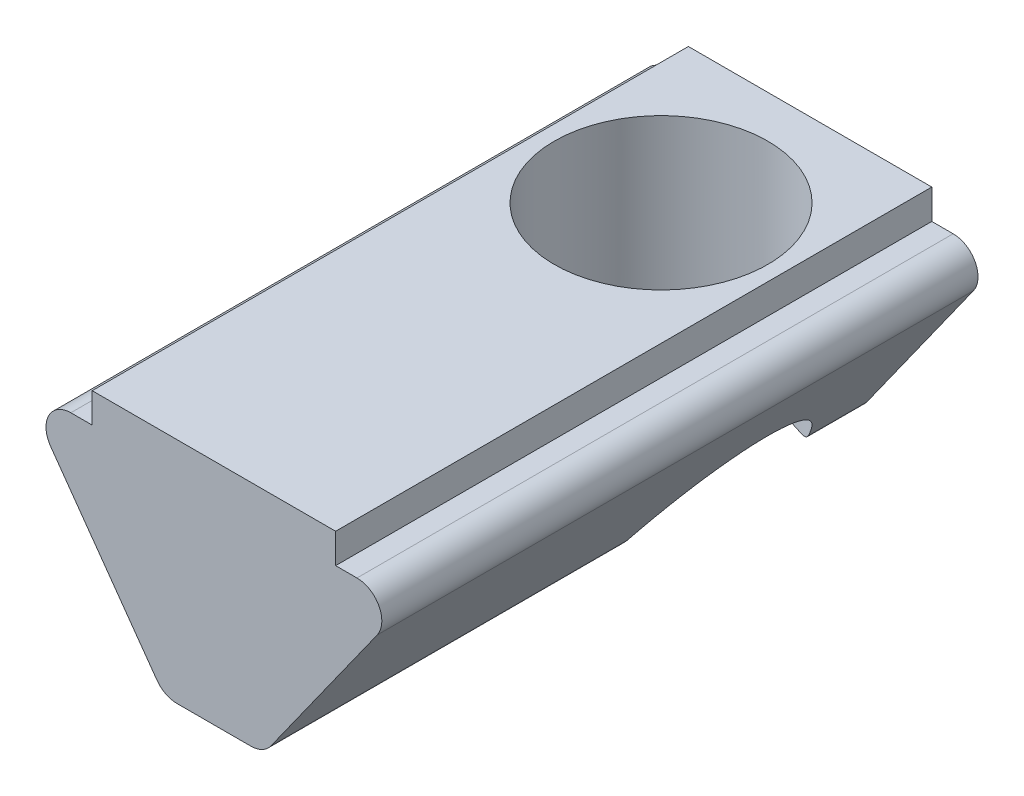
ISO-10303-21;
HEADER;
FILE_DESCRIPTION(('STEP AP214'),'2;1');
FILE_NAME('part.step','',(''),(''),'','','');
FILE_SCHEMA(('AUTOMOTIVE_DESIGN { 1 0 10303 214 1 1 1 1 }'));
ENDSEC;
DATA;
#1=APPLICATION_CONTEXT('core data for automotive mechanical design processes');
#2=APPLICATION_PROTOCOL_DEFINITION('international standard','automotive_design',2000,#1);
#3=PRODUCT_CONTEXT('',#1,'mechanical');
#4=PRODUCT('Part','Part','',(#3));
#5=PRODUCT_RELATED_PRODUCT_CATEGORY('part','',(#4));
#6=PRODUCT_DEFINITION_FORMATION('','',#4);
#7=PRODUCT_DEFINITION_CONTEXT('part definition',#1,'design');
#8=PRODUCT_DEFINITION('design','',#6,#7);
#9=PRODUCT_DEFINITION_SHAPE('','',#8);
#10=(LENGTH_UNIT() NAMED_UNIT(*) SI_UNIT(.MILLI.,.METRE.));
#11=(NAMED_UNIT(*) PLANE_ANGLE_UNIT() SI_UNIT($,.RADIAN.));
#12=(NAMED_UNIT(*) SI_UNIT($,.STERADIAN.) SOLID_ANGLE_UNIT());
#13=UNCERTAINTY_MEASURE_WITH_UNIT(LENGTH_MEASURE(1.E-05),#10,'distance_accuracy_value','');
#14=(GEOMETRIC_REPRESENTATION_CONTEXT(3) GLOBAL_UNCERTAINTY_ASSIGNED_CONTEXT((#13)) GLOBAL_UNIT_ASSIGNED_CONTEXT((#10,
#11,#12)) REPRESENTATION_CONTEXT('',''));
#15=CARTESIAN_POINT('',(0.,0.,0.));
#16=DIRECTION('',(0.,0.,1.));
#17=DIRECTION('',(1.,0.,0.));
#18=AXIS2_PLACEMENT_3D('',#15,#16,#17);
#19=CARTESIAN_POINT('',(1.,-4.6,6.));
#20=DIRECTION('',(0.,1.,0.));
#21=DIRECTION('',(0.,0.,1.));
#22=AXIS2_PLACEMENT_3D('',#19,#20,#21);
#23=PLANE('',#22);
#24=DIRECTION('',(0.,0.,-1.));
#25=VECTOR('',#24,1.);
#26=CARTESIAN_POINT('',(0.74231672797445,-4.6,6.));
#27=LINE('',#26,#25);
#28=CARTESIAN_POINT('',(0.74231672797445,-4.6,-6.));
#29=VERTEX_POINT('',#28);
#30=CARTESIAN_POINT('',(0.74231672797445,-4.6,-5.01778737119879));
#31=VERTEX_POINT('',#30);
#32=EDGE_CURVE('E201',#29,#31,#27,.F.);
#33=ORIENTED_EDGE('',*,*,#32,.T.);
#34=CARTESIAN_POINT('',(0.,-4.6,-3.));
#35=DIRECTION('',(0.,1.,0.));
#36=DIRECTION('',(0.,0.,1.));
#37=AXIS2_PLACEMENT_3D('',#34,#35,#36);
#38=CIRCLE('',#37,2.15);
#39=CARTESIAN_POINT('',(-0.742316727974448,-4.6,-5.01778737119879));
#40=VERTEX_POINT('',#39);
#41=EDGE_CURVE('E167',#40,#31,#38,.F.);
#42=ORIENTED_EDGE('',*,*,#41,.F.);
#43=DIRECTION('',(0.,0.,-1.));
#44=VECTOR('',#43,1.);
#45=CARTESIAN_POINT('',(-0.742316727974448,-4.6,6.));
#46=LINE('',#45,#44);
#47=CARTESIAN_POINT('',(-0.742316727974448,-4.6,-6.));
#48=VERTEX_POINT('',#47);
#49=EDGE_CURVE('E238',#40,#48,#46,.T.);
#50=ORIENTED_EDGE('',*,*,#49,.T.);
#51=DIRECTION('',(1.,0.,0.));
#52=VECTOR('',#51,1.);
#53=CARTESIAN_POINT('',(1.,-4.6,-6.));
#54=LINE('',#53,#52);
#55=EDGE_CURVE('E298',#48,#29,#54,.T.);
#56=ORIENTED_EDGE('',*,*,#55,.T.);
#57=EDGE_LOOP('',(#33,#42,#50,#56));
#58=FACE_BOUND('',#57,.T.);
#59=ADVANCED_FACE('F35',(#58),#23,.F.);
#60=CARTESIAN_POINT('',(0.74231672797445,-4.1,6.));
#61=DIRECTION('',(0.,0.,-1.));
#62=DIRECTION('',(-1.,0.,0.));
#63=AXIS2_PLACEMENT_3D('',#60,#61,#62);
#64=CYLINDRICAL_SURFACE('',#63,0.5);
#65=CARTESIAN_POINT('',(1.14952710635185,-4.3901373945939,-4.81688949354724));
#66=CARTESIAN_POINT('',(1.13173736297539,-4.4150877080663,-4.82816080350396));
#67=CARTESIAN_POINT('',(1.11190239005543,-4.43809281943189,-4.84033052066841));
#68=CARTESIAN_POINT('',(1.06876198728695,-4.47991898920703,-4.86570548382413));
#69=CARTESIAN_POINT('',(1.04545587136794,-4.4987392186384,-4.87891093428299));
#70=CARTESIAN_POINT('',(0.99604083177095,-4.53186497501322,-4.90556937303818));
#71=CARTESIAN_POINT('',(0.969936515924932,-4.54617777585053,-4.91902192504959));
#72=CARTESIAN_POINT('',(0.91548378360084,-4.56999355661855,-4.94558546815453));
#73=CARTESIAN_POINT('',(0.887138258198267,-4.57950261979633,-4.95869687119497));
#74=CARTESIAN_POINT('',(0.839240169750027,-4.59089546232888,-4.9795443739902));
#75=CARTESIAN_POINT('',(0.820145559913514,-4.59428838900531,-4.98753383771932));
#76=CARTESIAN_POINT('',(0.781514318715598,-4.59884041420793,-5.00304076126853));
#77=CARTESIAN_POINT('',(0.761977870892479,-4.60000042364403,-5.01055841235146));
#78=CARTESIAN_POINT('',(0.74231672797445,-4.6,-5.01778737119879));
#79=B_SPLINE_CURVE_WITH_KNOTS('',3,(#65,#66,#67,#68,#69,#70,#71,#72,#73,#74,#75,#76,#77,#78),
.UNSPECIFIED.,.F.,.F.,(4,2,2,2,2,2,4),(0.,0.0977320349573765,0.195483412322803,
0.293076224657291,0.390545137879546,0.45335067247078,0.516130580353906),.UNSPECIFIED.);
#80=CARTESIAN_POINT('',(1.14952710635185,-4.3901373945939,-4.81688949354724));
#81=VERTEX_POINT('',#80);
#82=EDGE_CURVE('E156',#81,#31,#79,.T.);
#83=ORIENTED_EDGE('',*,*,#82,.T.);
#84=ORIENTED_EDGE('',*,*,#32,.F.);
#85=CARTESIAN_POINT('',(0.74231672797445,-4.1,-6.));
#86=DIRECTION('',(0.,0.,-1.));
#87=DIRECTION('',(-1.,0.,0.));
#88=AXIS2_PLACEMENT_3D('',#85,#86,#87);
#89=CIRCLE('',#88,0.5);
#90=CARTESIAN_POINT('',(1.14952710635185,-4.3901373945939,-6.));
#91=VERTEX_POINT('',#90);
#92=EDGE_CURVE('E236',#91,#29,#89,.T.);
#93=ORIENTED_EDGE('',*,*,#92,.F.);
#94=DIRECTION('',(0.,0.,-1.));
#95=VECTOR('',#94,1.);
#96=CARTESIAN_POINT('',(1.14952710635185,-4.3901373945939,6.));
#97=LINE('',#96,#95);
#98=EDGE_CURVE('E226',#81,#91,#97,.T.);
#99=ORIENTED_EDGE('',*,*,#98,.F.);
#100=EDGE_LOOP('',(#83,#84,#93,#99));
#101=FACE_BOUND('',#100,.T.);
#102=ADVANCED_FACE('F330',(#101),#64,.T.);
#103=CARTESIAN_POINT('',(-0.742316727974448,-4.1,6.));
#104=DIRECTION('',(0.,0.,-1.));
#105=DIRECTION('',(-1.,0.,0.));
#106=AXIS2_PLACEMENT_3D('',#103,#104,#105);
#107=CYLINDRICAL_SURFACE('',#106,0.5);
#108=CARTESIAN_POINT('',(-0.742316727974448,-4.6,-5.01778737119879));
#109=CARTESIAN_POINT('',(-0.77293039982853,-4.60000722253714,-5.00655257672451));
#110=CARTESIAN_POINT('',(-0.80322413296952,-4.59719152537787,-4.99459080432152));
#111=CARTESIAN_POINT('',(-0.862431200381572,-4.5862875448393,-4.96969883287794));
#112=CARTESIAN_POINT('',(-0.891344925389765,-4.57820076354028,-4.95676891065604));
#113=CARTESIAN_POINT('',(-0.947032250256732,-4.55714162142106,-4.9304369413801));
#114=CARTESIAN_POINT('',(-0.97380867656137,-4.54417584700836,-4.91703555279412));
#115=CARTESIAN_POINT('',(-1.02467125898475,-4.51370631177211,-4.8903359754519));
#116=CARTESIAN_POINT('',(-1.04876023711038,-4.49620737648721,-4.87703769235011));
#117=CARTESIAN_POINT('',(-1.08575186107479,-4.46390291992121,-4.85578161317311));
#118=CARTESIAN_POINT('',(-1.09960467580175,-4.45032200142389,-4.84759355596957));
#119=CARTESIAN_POINT('',(-1.12576376060292,-4.42147535837472,-4.83177260168619));
#120=CARTESIAN_POINT('',(-1.13807099672438,-4.40621069754941,-4.82413935909507));
#121=CARTESIAN_POINT('',(-1.14952710635185,-4.3901373945939,-4.81688949354724));
#122=B_SPLINE_CURVE_WITH_KNOTS('',3,(#108,#109,#110,#111,#112,#113,#114,#115,#116,#117,#118,
#119,#120,#121),.UNSPECIFIED.,.F.,.F.,(4,2,2,2,2,2,4),(0.,0.0976307298617979,0.195233650431587,
0.292705281670961,0.390073577936099,0.453122789644932,0.516132394881613),.UNSPECIFIED.);
#123=CARTESIAN_POINT('',(-1.14952710635185,-4.3901373945939,-4.81688949354724));
#124=VERTEX_POINT('',#123);
#125=EDGE_CURVE('E254',#40,#124,#122,.T.);
#126=ORIENTED_EDGE('',*,*,#125,.T.);
#127=DIRECTION('',(0.,0.,-1.));
#128=VECTOR('',#127,1.);
#129=CARTESIAN_POINT('',(-1.14952710635185,-4.3901373945939,6.));
#130=LINE('',#129,#128);
#131=CARTESIAN_POINT('',(-1.14952710635185,-4.3901373945939,-6.));
#132=VERTEX_POINT('',#131);
#133=EDGE_CURVE('E166',#132,#124,#130,.F.);
#134=ORIENTED_EDGE('',*,*,#133,.F.);
#135=CARTESIAN_POINT('',(-0.742316727974448,-4.1,-6.));
#136=DIRECTION('',(0.,0.,-1.));
#137=DIRECTION('',(-1.,0.,0.));
#138=AXIS2_PLACEMENT_3D('',#135,#136,#137);
#139=CIRCLE('',#138,0.5);
#140=EDGE_CURVE('E234',#48,#132,#139,.T.);
#141=ORIENTED_EDGE('',*,*,#140,.F.);
#142=ORIENTED_EDGE('',*,*,#49,.F.);
#143=EDGE_LOOP('',(#126,#134,#141,#142));
#144=FACE_BOUND('',#143,.T.);
#145=ADVANCED_FACE('F326',(#144),#107,.T.);
#146=CARTESIAN_POINT('',(-2.45,-0.6,6.));
#147=DIRECTION('',(1.,0.,0.));
#148=DIRECTION('',(0.,0.,-1.));
#149=AXIS2_PLACEMENT_3D('',#146,#147,#148);
#150=PLANE('',#149);
#151=DIRECTION('',(0.,-1.,0.));
#152=VECTOR('',#151,1.);
#153=CARTESIAN_POINT('',(-2.45,-0.6,-6.));
#154=LINE('',#153,#152);
#155=CARTESIAN_POINT('',(-2.45,0.,-6.));
#156=VERTEX_POINT('',#155);
#157=CARTESIAN_POINT('',(-2.45,-0.6,-6.));
#158=VERTEX_POINT('',#157);
#159=EDGE_CURVE('E250',#156,#158,#154,.T.);
#160=ORIENTED_EDGE('',*,*,#159,.T.);
#161=DIRECTION('',(0.,0.,-1.));
#162=VECTOR('',#161,1.);
#163=CARTESIAN_POINT('',(-2.45,-0.6,6.));
#164=LINE('',#163,#162);
#165=CARTESIAN_POINT('',(-2.45,-0.6,6.));
#166=VERTEX_POINT('',#165);
#167=EDGE_CURVE('E314',#166,#158,#164,.T.);
#168=ORIENTED_EDGE('',*,*,#167,.F.);
#169=DIRECTION('',(0.,-1.,0.));
#170=VECTOR('',#169,1.);
#171=CARTESIAN_POINT('',(-2.45,-0.6,6.));
#172=LINE('',#171,#170);
#173=CARTESIAN_POINT('',(-2.45,0.,6.));
#174=VERTEX_POINT('',#173);
#175=EDGE_CURVE('E193',#174,#166,#172,.T.);
#176=ORIENTED_EDGE('',*,*,#175,.F.);
#177=DIRECTION('',(0.,0.,-1.));
#178=VECTOR('',#177,1.);
#179=CARTESIAN_POINT('',(-2.45,0.,6.));
#180=LINE('',#179,#178);
#181=EDGE_CURVE('E292',#174,#156,#180,.T.);
#182=ORIENTED_EDGE('',*,*,#181,.T.);
#183=EDGE_LOOP('',(#160,#168,#176,#182));
#184=FACE_BOUND('',#183,.T.);
#185=ADVANCED_FACE('F317',(#184),#150,.F.);
#186=CARTESIAN_POINT('',(-3.85,-0.6,6.));
#187=DIRECTION('',(0.,-1.,0.));
#188=DIRECTION('',(0.,0.,-1.));
#189=AXIS2_PLACEMENT_3D('',#186,#187,#188);
#190=PLANE('',#189);
#191=DIRECTION('',(-1.,0.,0.));
#192=VECTOR('',#191,1.);
#193=CARTESIAN_POINT('',(-3.85,-0.6,-6.));
#194=LINE('',#193,#192);
#195=CARTESIAN_POINT('',(-2.87981672797445,-0.6,-6.));
#196=VERTEX_POINT('',#195);
#197=EDGE_CURVE('E186',#158,#196,#194,.T.);
#198=ORIENTED_EDGE('',*,*,#197,.T.);
#199=DIRECTION('',(0.,0.,-1.));
#200=VECTOR('',#199,1.);
#201=CARTESIAN_POINT('',(-2.87981672797445,-0.6,6.));
#202=LINE('',#201,#200);
#203=CARTESIAN_POINT('',(-2.87981672797445,-0.6,6.));
#204=VERTEX_POINT('',#203);
#205=EDGE_CURVE('E43',#196,#204,#202,.F.);
#206=ORIENTED_EDGE('',*,*,#205,.T.);
#207=DIRECTION('',(-1.,0.,0.));
#208=VECTOR('',#207,1.);
#209=CARTESIAN_POINT('',(-3.85,-0.6,6.));
#210=LINE('',#209,#208);
#211=EDGE_CURVE('E184',#166,#204,#210,.T.);
#212=ORIENTED_EDGE('',*,*,#211,.F.);
#213=ORIENTED_EDGE('',*,*,#167,.T.);
#214=EDGE_LOOP('',(#198,#206,#212,#213));
#215=FACE_BOUND('',#214,.T.);
#216=ADVANCED_FACE('F182',(#215),#190,.F.);
#217=CARTESIAN_POINT('',(-0.999999999999999,-4.6,6.));
#218=DIRECTION('',(0.814420756754799,0.580274789187795,0.));
#219=DIRECTION('',(-0.580274789187795,0.8144207567548,0.));
#220=AXIS2_PLACEMENT_3D('',#217,#218,#219);
#221=PLANE('',#220);
#222=ORIENTED_EDGE('',*,*,#133,.T.);
#223=CARTESIAN_POINT('',(0.,-6.00350877192982,-3.));
#224=DIRECTION('',(0.814420756754799,0.580274789187795,0.));
#225=DIRECTION('',(-0.580274789187795,0.8144207567548,0.));
#226=AXIS2_PLACEMENT_3D('',#223,#224,#225);
#227=ELLIPSE('',#226,3.70514115047,2.15);
#228=CARTESIAN_POINT('',(-1.14952710635185,-4.3901373945939,-1.18311050645276));
#229=VERTEX_POINT('',#228);
#230=EDGE_CURVE('E150',#229,#124,#227,.F.);
#231=ORIENTED_EDGE('',*,*,#230,.F.);
#232=CARTESIAN_POINT('',(-1.14952710635185,-4.3901373945939,6.));
#233=VERTEX_POINT('',#232);
#234=EDGE_CURVE('E162',#229,#233,#130,.F.);
#235=ORIENTED_EDGE('',*,*,#234,.T.);
#236=DIRECTION('',(0.580274789187795,-0.8144207567548,0.));
#237=VECTOR('',#236,1.);
#238=CARTESIAN_POINT('',(-0.999999999999999,-4.6,6.));
#239=LINE('',#238,#237);
#240=CARTESIAN_POINT('',(-3.28702710635185,-1.3901373945939,6.));
#241=VERTEX_POINT('',#240);
#242=EDGE_CURVE('E195',#241,#233,#239,.T.);
#243=ORIENTED_EDGE('',*,*,#242,.F.);
#244=DIRECTION('',(0.,0.,-1.));
#245=VECTOR('',#244,1.);
#246=CARTESIAN_POINT('',(-3.28702710635185,-1.3901373945939,6.));
#247=LINE('',#246,#245);
#248=CARTESIAN_POINT('',(-3.28702710635185,-1.3901373945939,-6.));
#249=VERTEX_POINT('',#248);
#250=EDGE_CURVE('E172',#241,#249,#247,.T.);
#251=ORIENTED_EDGE('',*,*,#250,.T.);
#252=DIRECTION('',(0.580274789187795,-0.8144207567548,0.));
#253=VECTOR('',#252,1.);
#254=CARTESIAN_POINT('',(-0.999999999999999,-4.6,-6.));
#255=LINE('',#254,#253);
#256=EDGE_CURVE('E296',#249,#132,#255,.T.);
#257=ORIENTED_EDGE('',*,*,#256,.T.);
#258=EDGE_LOOP('',(#222,#231,#235,#243,#251,#257));
#259=FACE_BOUND('',#258,.T.);
#260=ADVANCED_FACE('F160',(#259),#221,.F.);
#261=CARTESIAN_POINT('',(-0.742316727974448,-4.6,6.));
#262=VERTEX_POINT('',#261);
#263=CARTESIAN_POINT('',(-0.742316727974448,-4.6,-0.982212628801215));
#264=VERTEX_POINT('',#263);
#265=EDGE_CURVE('E239',#262,#264,#46,.T.);
#266=ORIENTED_EDGE('',*,*,#265,.T.);
#267=CARTESIAN_POINT('',(0.74231672797445,-4.6,-0.982212628801215));
#268=VERTEX_POINT('',#267);
#269=EDGE_CURVE('E50',#268,#264,#38,.F.);
#270=ORIENTED_EDGE('',*,*,#269,.F.);
#271=CARTESIAN_POINT('',(0.74231672797445,-4.6,6.));
#272=VERTEX_POINT('',#271);
#273=EDGE_CURVE('E240',#268,#272,#27,.F.);
#274=ORIENTED_EDGE('',*,*,#273,.T.);
#275=DIRECTION('',(1.,0.,0.));
#276=VECTOR('',#275,1.);
#277=CARTESIAN_POINT('',(1.,-4.6,6.));
#278=LINE('',#277,#276);
#279=EDGE_CURVE('E208',#262,#272,#278,.T.);
#280=ORIENTED_EDGE('',*,*,#279,.F.);
#281=EDGE_LOOP('',(#266,#270,#274,#280));
#282=FACE_BOUND('',#281,.T.);
#283=ADVANCED_FACE('F247',(#282),#23,.F.);
#284=CARTESIAN_POINT('',(3.85,-0.599999999999999,6.));
#285=DIRECTION('',(-0.8144207567548,0.580274789187795,0.));
#286=DIRECTION('',(-0.580274789187795,-0.8144207567548,0.));
#287=AXIS2_PLACEMENT_3D('',#284,#285,#286);
#288=PLANE('',#287);
#289=CARTESIAN_POINT('',(1.14952710635185,-4.3901373945939,6.));
#290=VERTEX_POINT('',#289);
#291=CARTESIAN_POINT('',(1.14952710635185,-4.3901373945939,-1.18311050645276));
#292=VERTEX_POINT('',#291);
#293=EDGE_CURVE('E216',#290,#292,#97,.T.);
#294=ORIENTED_EDGE('',*,*,#293,.T.);
#295=CARTESIAN_POINT('',(0.,-6.00350877192983,-3.));
#296=DIRECTION('',(-0.8144207567548,0.580274789187795,0.));
#297=DIRECTION('',(0.580274789187795,0.8144207567548,0.));
#298=AXIS2_PLACEMENT_3D('',#295,#296,#297);
#299=ELLIPSE('',#298,3.70514115047,2.15);
#300=EDGE_CURVE('E248',#81,#292,#299,.F.);
#301=ORIENTED_EDGE('',*,*,#300,.F.);
#302=ORIENTED_EDGE('',*,*,#98,.T.);
#303=DIRECTION('',(0.580274789187795,0.8144207567548,0.));
#304=VECTOR('',#303,1.);
#305=CARTESIAN_POINT('',(3.85,-0.599999999999999,-6.));
#306=LINE('',#305,#304);
#307=CARTESIAN_POINT('',(3.28702710635185,-1.3901373945939,-6.));
#308=VERTEX_POINT('',#307);
#309=EDGE_CURVE('E300',#91,#308,#306,.T.);
#310=ORIENTED_EDGE('',*,*,#309,.T.);
#311=DIRECTION('',(0.,0.,-1.));
#312=VECTOR('',#311,1.);
#313=CARTESIAN_POINT('',(3.28702710635185,-1.3901373945939,6.));
#314=LINE('',#313,#312);
#315=CARTESIAN_POINT('',(3.28702710635185,-1.3901373945939,6.));
#316=VERTEX_POINT('',#315);
#317=EDGE_CURVE('E219',#308,#316,#314,.F.);
#318=ORIENTED_EDGE('',*,*,#317,.T.);
#319=DIRECTION('',(0.580274789187795,0.8144207567548,0.));
#320=VECTOR('',#319,1.);
#321=CARTESIAN_POINT('',(3.85,-0.599999999999999,6.));
#322=LINE('',#321,#320);
#323=EDGE_CURVE('E206',#290,#316,#322,.T.);
#324=ORIENTED_EDGE('',*,*,#323,.F.);
#325=EDGE_LOOP('',(#294,#301,#302,#310,#318,#324));
#326=FACE_BOUND('',#325,.T.);
#327=ADVANCED_FACE('F214',(#326),#288,.F.);
#328=CARTESIAN_POINT('',(2.45,-0.599999999999999,6.));
#329=DIRECTION('',(0.,-1.,0.));
#330=DIRECTION('',(1.,0.,0.));
#331=AXIS2_PLACEMENT_3D('',#328,#329,#330);
#332=PLANE('',#331);
#333=DIRECTION('',(-1.,0.,0.));
#334=VECTOR('',#333,1.);
#335=CARTESIAN_POINT('',(2.45,-0.599999999999999,6.));
#336=LINE('',#335,#334);
#337=CARTESIAN_POINT('',(2.87981672797445,-0.599999999999999,6.));
#338=VERTEX_POINT('',#337);
#339=CARTESIAN_POINT('',(2.45,-0.599999999999999,6.));
#340=VERTEX_POINT('',#339);
#341=EDGE_CURVE('E220',#338,#340,#336,.T.);
#342=ORIENTED_EDGE('',*,*,#341,.F.);
#343=DIRECTION('',(0.,0.,-1.));
#344=VECTOR('',#343,1.);
#345=CARTESIAN_POINT('',(2.87981672797445,-0.599999999999999,6.));
#346=LINE('',#345,#344);
#347=CARTESIAN_POINT('',(2.87981672797445,-0.599999999999999,-6.));
#348=VERTEX_POINT('',#347);
#349=EDGE_CURVE('E11',#338,#348,#346,.T.);
#350=ORIENTED_EDGE('',*,*,#349,.T.);
#351=DIRECTION('',(-1.,0.,0.));
#352=VECTOR('',#351,1.);
#353=CARTESIAN_POINT('',(2.45,-0.599999999999999,-6.));
#354=LINE('',#353,#352);
#355=CARTESIAN_POINT('',(2.45,-0.599999999999999,-6.));
#356=VERTEX_POINT('',#355);
#357=EDGE_CURVE('E302',#348,#356,#354,.T.);
#358=ORIENTED_EDGE('',*,*,#357,.T.);
#359=DIRECTION('',(0.,0.,-1.));
#360=VECTOR('',#359,1.);
#361=CARTESIAN_POINT('',(2.45,-0.599999999999999,6.));
#362=LINE('',#361,#360);
#363=EDGE_CURVE('E312',#340,#356,#362,.T.);
#364=ORIENTED_EDGE('',*,*,#363,.F.);
#365=EDGE_LOOP('',(#342,#350,#358,#364));
#366=FACE_BOUND('',#365,.T.);
#367=ADVANCED_FACE('F336',(#366),#332,.F.);
#368=CARTESIAN_POINT('',(2.45,0.,6.));
#369=DIRECTION('',(-1.,0.,0.));
#370=DIRECTION('',(0.,0.,1.));
#371=AXIS2_PLACEMENT_3D('',#368,#369,#370);
#372=PLANE('',#371);
#373=DIRECTION('',(0.,1.,0.));
#374=VECTOR('',#373,1.);
#375=CARTESIAN_POINT('',(2.45,0.,-6.));
#376=LINE('',#375,#374);
#377=CARTESIAN_POINT('',(2.45,0.,-6.));
#378=VERTEX_POINT('',#377);
#379=EDGE_CURVE('E304',#356,#378,#376,.T.);
#380=ORIENTED_EDGE('',*,*,#379,.T.);
#381=DIRECTION('',(0.,0.,-1.));
#382=VECTOR('',#381,1.);
#383=CARTESIAN_POINT('',(2.45,0.,6.));
#384=LINE('',#383,#382);
#385=CARTESIAN_POINT('',(2.45,0.,6.));
#386=VERTEX_POINT('',#385);
#387=EDGE_CURVE('E309',#386,#378,#384,.T.);
#388=ORIENTED_EDGE('',*,*,#387,.F.);
#389=DIRECTION('',(0.,1.,0.));
#390=VECTOR('',#389,1.);
#391=CARTESIAN_POINT('',(2.45,0.,6.));
#392=LINE('',#391,#390);
#393=EDGE_CURVE('E288',#340,#386,#392,.T.);
#394=ORIENTED_EDGE('',*,*,#393,.F.);
#395=ORIENTED_EDGE('',*,*,#363,.T.);
#396=EDGE_LOOP('',(#380,#388,#394,#395));
#397=FACE_BOUND('',#396,.T.);
#398=ADVANCED_FACE('F340',(#397),#372,.F.);
#399=CARTESIAN_POINT('',(-2.45,0.,6.));
#400=DIRECTION('',(0.,-1.,0.));
#401=DIRECTION('',(1.,0.,0.));
#402=AXIS2_PLACEMENT_3D('',#399,#400,#401);
#403=PLANE('',#402);
#404=CARTESIAN_POINT('',(0.,0.,-3.));
#405=DIRECTION('',(0.,1.,0.));
#406=DIRECTION('',(-1.,0.,0.));
#407=AXIS2_PLACEMENT_3D('',#404,#405,#406);
#408=CIRCLE('',#407,2.15);
#409=CARTESIAN_POINT('',(-2.15,0.,-3.));
#410=VERTEX_POINT('',#409);
#411=EDGE_CURVE('E256',#410,#410,#408,.T.);
#412=ORIENTED_EDGE('',*,*,#411,.F.);
#413=EDGE_LOOP('',(#412));
#414=FACE_BOUND('',#413,.T.);
#415=DIRECTION('',(-1.,0.,0.));
#416=VECTOR('',#415,1.);
#417=CARTESIAN_POINT('',(-2.45,0.,-6.));
#418=LINE('',#417,#416);
#419=EDGE_CURVE('E283',#378,#156,#418,.T.);
#420=ORIENTED_EDGE('',*,*,#419,.T.);
#421=ORIENTED_EDGE('',*,*,#181,.F.);
#422=DIRECTION('',(-1.,0.,0.));
#423=VECTOR('',#422,1.);
#424=CARTESIAN_POINT('',(-2.45,0.,6.));
#425=LINE('',#424,#423);
#426=EDGE_CURVE('E290',#386,#174,#425,.T.);
#427=ORIENTED_EDGE('',*,*,#426,.F.);
#428=ORIENTED_EDGE('',*,*,#387,.T.);
#429=EDGE_LOOP('',(#420,#421,#427,#428));
#430=FACE_BOUND('',#429,.T.);
#431=ADVANCED_FACE('F344',(#414,#430),#403,.F.);
#432=CARTESIAN_POINT('',(0.,0.,6.));
#433=DIRECTION('',(0.,0.,-1.));
#434=DIRECTION('',(-1.,0.,0.));
#435=AXIS2_PLACEMENT_3D('',#432,#433,#434);
#436=PLANE('',#435);
#437=ORIENTED_EDGE('',*,*,#279,.T.);
#438=CARTESIAN_POINT('',(0.74231672797445,-4.1,6.));
#439=DIRECTION('',(0.,0.,-1.));
#440=DIRECTION('',(-1.,0.,0.));
#441=AXIS2_PLACEMENT_3D('',#438,#439,#440);
#442=CIRCLE('',#441,0.5);
#443=EDGE_CURVE('E175',#272,#290,#442,.F.);
#444=ORIENTED_EDGE('',*,*,#443,.T.);
#445=ORIENTED_EDGE('',*,*,#323,.T.);
#446=CARTESIAN_POINT('',(2.87981672797445,-1.1,6.));
#447=DIRECTION('',(0.,0.,-1.));
#448=DIRECTION('',(-1.,0.,0.));
#449=AXIS2_PLACEMENT_3D('',#446,#447,#448);
#450=CIRCLE('',#449,0.5);
#451=EDGE_CURVE('E58',#316,#338,#450,.F.);
#452=ORIENTED_EDGE('',*,*,#451,.T.);
#453=ORIENTED_EDGE('',*,*,#341,.T.);
#454=ORIENTED_EDGE('',*,*,#393,.T.);
#455=ORIENTED_EDGE('',*,*,#426,.T.);
#456=ORIENTED_EDGE('',*,*,#175,.T.);
#457=ORIENTED_EDGE('',*,*,#211,.T.);
#458=CARTESIAN_POINT('',(-2.87981672797445,-1.1,6.));
#459=DIRECTION('',(0.,0.,-1.));
#460=DIRECTION('',(-1.,0.,0.));
#461=AXIS2_PLACEMENT_3D('',#458,#459,#460);
#462=CIRCLE('',#461,0.5);
#463=EDGE_CURVE('E191',#204,#241,#462,.F.);
#464=ORIENTED_EDGE('',*,*,#463,.T.);
#465=ORIENTED_EDGE('',*,*,#242,.T.);
#466=CARTESIAN_POINT('',(-0.742316727974448,-4.1,6.));
#467=DIRECTION('',(0.,0.,-1.));
#468=DIRECTION('',(-1.,0.,0.));
#469=AXIS2_PLACEMENT_3D('',#466,#467,#468);
#470=CIRCLE('',#469,0.5);
#471=EDGE_CURVE('E171',#233,#262,#470,.F.);
#472=ORIENTED_EDGE('',*,*,#471,.T.);
#473=EDGE_LOOP('',(#437,#444,#445,#452,#453,#454,#455,#456,#457,#464,#465,#472));
#474=FACE_BOUND('',#473,.T.);
#475=ADVANCED_FACE('F190',(#474),#436,.F.);
#476=CARTESIAN_POINT('',(0.,0.,-6.));
#477=DIRECTION('',(0.,0.,-1.));
#478=DIRECTION('',(-1.,0.,0.));
#479=AXIS2_PLACEMENT_3D('',#476,#477,#478);
#480=PLANE('',#479);
#481=ORIENTED_EDGE('',*,*,#309,.F.);
#482=ORIENTED_EDGE('',*,*,#92,.T.);
#483=ORIENTED_EDGE('',*,*,#55,.F.);
#484=ORIENTED_EDGE('',*,*,#140,.T.);
#485=ORIENTED_EDGE('',*,*,#256,.F.);
#486=CARTESIAN_POINT('',(-2.87981672797445,-1.1,-6.));
#487=DIRECTION('',(0.,0.,-1.));
#488=DIRECTION('',(-1.,0.,0.));
#489=AXIS2_PLACEMENT_3D('',#486,#487,#488);
#490=CIRCLE('',#489,0.5);
#491=EDGE_CURVE('E228',#249,#196,#490,.T.);
#492=ORIENTED_EDGE('',*,*,#491,.T.);
#493=ORIENTED_EDGE('',*,*,#197,.F.);
#494=ORIENTED_EDGE('',*,*,#159,.F.);
#495=ORIENTED_EDGE('',*,*,#419,.F.);
#496=ORIENTED_EDGE('',*,*,#379,.F.);
#497=ORIENTED_EDGE('',*,*,#357,.F.);
#498=CARTESIAN_POINT('',(2.87981672797445,-1.1,-6.));
#499=DIRECTION('',(0.,0.,-1.));
#500=DIRECTION('',(-1.,0.,0.));
#501=AXIS2_PLACEMENT_3D('',#498,#499,#500);
#502=CIRCLE('',#501,0.5);
#503=EDGE_CURVE('E225',#348,#308,#502,.T.);
#504=ORIENTED_EDGE('',*,*,#503,.T.);
#505=EDGE_LOOP('',(#481,#482,#483,#484,#485,#492,#493,#494,#495,#496,#497,#504));
#506=FACE_BOUND('',#505,.T.);
#507=ADVANCED_FACE('F322',(#506),#480,.T.);
#508=CARTESIAN_POINT('',(0.74231672797445,-4.6,-0.982212628801213));
#509=CARTESIAN_POINT('',(0.772930399828531,-4.60000722253714,-0.993447423275494));
#510=CARTESIAN_POINT('',(0.803224132969521,-4.59719152537787,-1.00540919567848));
#511=CARTESIAN_POINT('',(0.862431200381573,-4.5862875448393,-1.03030116712206));
#512=CARTESIAN_POINT('',(0.891344925389766,-4.57820076354028,-1.04323108934396));
#513=CARTESIAN_POINT('',(0.947032250256733,-4.55714162142106,-1.0695630586199));
#514=CARTESIAN_POINT('',(0.973808676561371,-4.54417584700836,-1.08296444720588));
#515=CARTESIAN_POINT('',(1.02467125898475,-4.51370631177211,-1.1096640245481));
#516=CARTESIAN_POINT('',(1.04876023711038,-4.49620737648721,-1.12296230764989));
#517=CARTESIAN_POINT('',(1.08575186107479,-4.46390291992121,-1.14421838682689));
#518=CARTESIAN_POINT('',(1.09960467580175,-4.45032200142389,-1.15240644403043));
#519=CARTESIAN_POINT('',(1.12576376060292,-4.42147535837472,-1.16822739831381));
#520=CARTESIAN_POINT('',(1.13807099672438,-4.4062106975494,-1.17586064090493));
#521=CARTESIAN_POINT('',(1.14952710635185,-4.3901373945939,-1.18311050645276));
#522=B_SPLINE_CURVE_WITH_KNOTS('',3,(#508,#509,#510,#511,#512,#513,#514,#515,#516,#517,#518,
#519,#520,#521),.UNSPECIFIED.,.F.,.F.,(4,2,2,2,2,2,4),(0.,0.0976307298617975,0.195233650431587,
0.292705281670961,0.390073577936098,0.453122789644932,0.516132394881614),.UNSPECIFIED.);
#523=EDGE_CURVE('E224',#268,#292,#522,.T.);
#524=ORIENTED_EDGE('',*,*,#523,.T.);
#525=ORIENTED_EDGE('',*,*,#293,.F.);
#526=ORIENTED_EDGE('',*,*,#443,.F.);
#527=ORIENTED_EDGE('',*,*,#273,.F.);
#528=EDGE_LOOP('',(#524,#525,#526,#527));
#529=FACE_BOUND('',#528,.T.);
#530=ADVANCED_FACE('F223',(#529),#64,.T.);
#531=CARTESIAN_POINT('',(-1.14952710635185,-4.3901373945939,-1.18311050645276));
#532=CARTESIAN_POINT('',(-1.13173736297539,-4.4150877080663,-1.17183919649604));
#533=CARTESIAN_POINT('',(-1.11190239005543,-4.43809281943189,-1.15966947933159));
#534=CARTESIAN_POINT('',(-1.06876198728695,-4.47991898920703,-1.13429451617587));
#535=CARTESIAN_POINT('',(-1.04545587136794,-4.4987392186384,-1.12108906571701));
#536=CARTESIAN_POINT('',(-0.99604083177095,-4.53186497501322,-1.09443062696182));
#537=CARTESIAN_POINT('',(-0.969936515924932,-4.54617777585053,-1.08097807495041));
#538=CARTESIAN_POINT('',(-0.91548378360084,-4.56999355661855,-1.05441453184547));
#539=CARTESIAN_POINT('',(-0.887138258198267,-4.57950261979633,-1.04130312880503));
#540=CARTESIAN_POINT('',(-0.839240169750027,-4.59089546232888,-1.0204556260098));
#541=CARTESIAN_POINT('',(-0.820145559913514,-4.59428838900531,-1.01246616228069));
#542=CARTESIAN_POINT('',(-0.781514318715598,-4.59884041420793,-0.99695923873147));
#543=CARTESIAN_POINT('',(-0.761977870892478,-4.60000042364404,-0.989441587648541));
#544=CARTESIAN_POINT('',(-0.742316727974448,-4.6,-0.982212628801214));
#545=B_SPLINE_CURVE_WITH_KNOTS('',3,(#531,#532,#533,#534,#535,#536,#537,#538,#539,#540,#541,
#542,#543,#544),.UNSPECIFIED.,.F.,.F.,(4,2,2,2,2,2,4),(0.,0.0977320349573767,0.195483412322802,
0.293076224657289,0.390545137879544,0.453350672470778,0.516130580353906),.UNSPECIFIED.);
#546=EDGE_CURVE('E146',#229,#264,#545,.T.);
#547=ORIENTED_EDGE('',*,*,#546,.T.);
#548=ORIENTED_EDGE('',*,*,#265,.F.);
#549=ORIENTED_EDGE('',*,*,#471,.F.);
#550=ORIENTED_EDGE('',*,*,#234,.F.);
#551=EDGE_LOOP('',(#547,#548,#549,#550));
#552=FACE_BOUND('',#551,.T.);
#553=ADVANCED_FACE('F170',(#552),#107,.T.);
#554=CARTESIAN_POINT('',(-2.87981672797445,-1.1,6.));
#555=DIRECTION('',(0.,0.,-1.));
#556=DIRECTION('',(-1.,0.,0.));
#557=AXIS2_PLACEMENT_3D('',#554,#555,#556);
#558=CYLINDRICAL_SURFACE('',#557,0.5);
#559=ORIENTED_EDGE('',*,*,#463,.F.);
#560=ORIENTED_EDGE('',*,*,#205,.F.);
#561=ORIENTED_EDGE('',*,*,#491,.F.);
#562=ORIENTED_EDGE('',*,*,#250,.F.);
#563=EDGE_LOOP('',(#559,#560,#561,#562));
#564=FACE_BOUND('',#563,.T.);
#565=ADVANCED_FACE('F198',(#564),#558,.T.);
#566=CARTESIAN_POINT('',(2.87981672797445,-1.1,6.));
#567=DIRECTION('',(0.,0.,-1.));
#568=DIRECTION('',(-1.,0.,0.));
#569=AXIS2_PLACEMENT_3D('',#566,#567,#568);
#570=CYLINDRICAL_SURFACE('',#569,0.5);
#571=ORIENTED_EDGE('',*,*,#451,.F.);
#572=ORIENTED_EDGE('',*,*,#317,.F.);
#573=ORIENTED_EDGE('',*,*,#503,.F.);
#574=ORIENTED_EDGE('',*,*,#349,.F.);
#575=EDGE_LOOP('',(#571,#572,#573,#574));
#576=FACE_BOUND('',#575,.T.);
#577=ADVANCED_FACE('F37',(#576),#570,.T.);
#578=CARTESIAN_POINT('',(0.,-4.601,-3.));
#579=DIRECTION('',(0.,1.,0.));
#580=DIRECTION('',(-1.,0.,0.));
#581=AXIS2_PLACEMENT_3D('',#578,#579,#580);
#582=CYLINDRICAL_SURFACE('',#581,2.15);
#583=ORIENTED_EDGE('',*,*,#269,.T.);
#584=ORIENTED_EDGE('',*,*,#546,.F.);
#585=ORIENTED_EDGE('',*,*,#230,.T.);
#586=ORIENTED_EDGE('',*,*,#125,.F.);
#587=ORIENTED_EDGE('',*,*,#41,.T.);
#588=ORIENTED_EDGE('',*,*,#82,.F.);
#589=ORIENTED_EDGE('',*,*,#300,.T.);
#590=ORIENTED_EDGE('',*,*,#523,.F.);
#591=EDGE_LOOP('',(#583,#584,#585,#586,#587,#588,#589,#590));
#592=FACE_BOUND('',#591,.T.);
#593=ORIENTED_EDGE('',*,*,#411,.T.);
#594=EDGE_LOOP('',(#593));
#595=FACE_BOUND('',#594,.T.);
#596=ADVANCED_FACE('F148',(#592,#595),#582,.F.);
#597=CLOSED_SHELL('',(#59,#102,#145,#185,#216,#260,#283,#327,#367,#398,#431,#475,#507,#530,#553,
#565,#577,#596));
#598=MANIFOLD_SOLID_BREP('B2',#597);
#599=ADVANCED_BREP_SHAPE_REPRESENTATION('',(#18,#598),#14);
#600=SHAPE_DEFINITION_REPRESENTATION(#9,#599);
ENDSEC;
END-ISO-10303-21;
